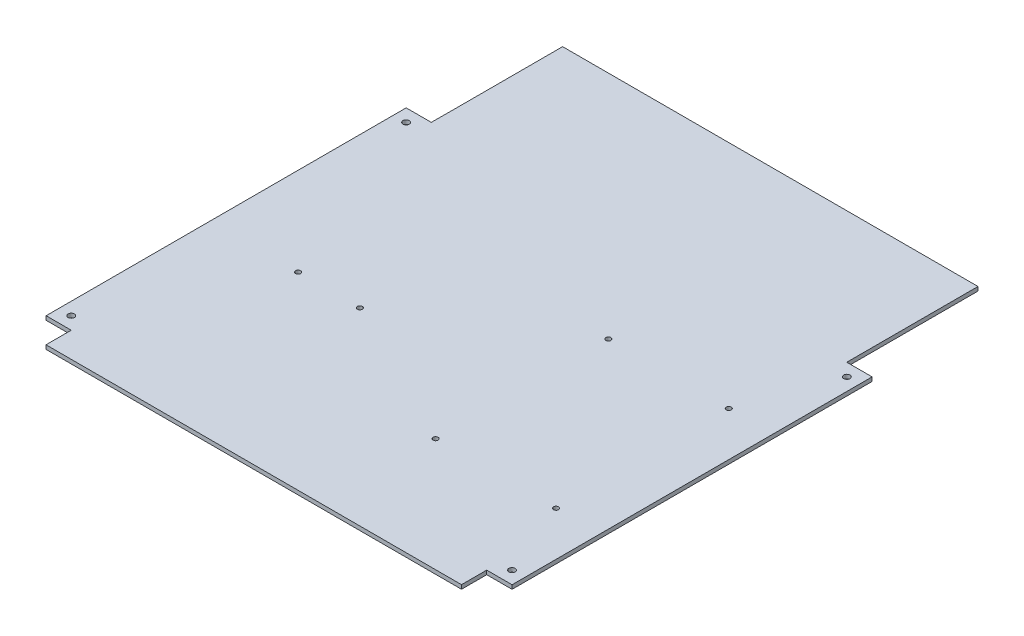
ISO-10303-21;
HEADER;
FILE_DESCRIPTION(('STEP AP214'),'2;1');
FILE_NAME('part.step','',(''),(''),'','','');
FILE_SCHEMA(('AUTOMOTIVE_DESIGN { 1 0 10303 214 1 1 1 1 }'));
ENDSEC;
DATA;
#1=APPLICATION_CONTEXT('core data for automotive mechanical design processes');
#2=APPLICATION_PROTOCOL_DEFINITION('international standard','automotive_design',2000,#1);
#3=PRODUCT_CONTEXT('',#1,'mechanical');
#4=PRODUCT('Part','Part','',(#3));
#5=PRODUCT_RELATED_PRODUCT_CATEGORY('part','',(#4));
#6=PRODUCT_DEFINITION_FORMATION('','',#4);
#7=PRODUCT_DEFINITION_CONTEXT('part definition',#1,'design');
#8=PRODUCT_DEFINITION('design','',#6,#7);
#9=PRODUCT_DEFINITION_SHAPE('','',#8);
#10=(LENGTH_UNIT() NAMED_UNIT(*) SI_UNIT(.MILLI.,.METRE.));
#11=(NAMED_UNIT(*) PLANE_ANGLE_UNIT() SI_UNIT($,.RADIAN.));
#12=(NAMED_UNIT(*) SI_UNIT($,.STERADIAN.) SOLID_ANGLE_UNIT());
#13=UNCERTAINTY_MEASURE_WITH_UNIT(LENGTH_MEASURE(1.E-05),#10,'distance_accuracy_value','');
#14=(GEOMETRIC_REPRESENTATION_CONTEXT(3) GLOBAL_UNCERTAINTY_ASSIGNED_CONTEXT((#13)) GLOBAL_UNIT_ASSIGNED_CONTEXT((#10,
#11,#12)) REPRESENTATION_CONTEXT('',''));
#15=CARTESIAN_POINT('',(0.,0.,0.));
#16=DIRECTION('',(0.,0.,1.));
#17=DIRECTION('',(1.,0.,0.));
#18=AXIS2_PLACEMENT_3D('',#15,#16,#17);
#19=CARTESIAN_POINT('',(54.0106400606065,0.,-22.3443599396149));
#20=DIRECTION('',(0.,1.,0.));
#21=DIRECTION('',(0.,0.,1.));
#22=AXIS2_PLACEMENT_3D('',#19,#20,#21);
#23=CYLINDRICAL_SURFACE('',#22,2.);
#24=CARTESIAN_POINT('',(54.0106400606065,0.,-22.3443599396149));
#25=DIRECTION('',(0.,1.,0.));
#26=DIRECTION('',(0.,0.,1.));
#27=AXIS2_PLACEMENT_3D('',#24,#25,#26);
#28=CIRCLE('',#27,2.);
#29=CARTESIAN_POINT('',(54.0106400606065,0.,-20.3443599396149));
#30=VERTEX_POINT('',#29);
#31=EDGE_CURVE('E214',#30,#30,#28,.T.);
#32=ORIENTED_EDGE('',*,*,#31,.F.);
#33=EDGE_LOOP('',(#32));
#34=FACE_BOUND('',#33,.T.);
#35=CARTESIAN_POINT('',(54.0106400606065,3.175,-22.3443599396149));
#36=DIRECTION('',(0.,1.,0.));
#37=DIRECTION('',(0.,0.,1.));
#38=AXIS2_PLACEMENT_3D('',#35,#36,#37);
#39=CIRCLE('',#38,2.);
#40=CARTESIAN_POINT('',(54.0106400606065,3.175,-20.3443599396149));
#41=VERTEX_POINT('',#40);
#42=EDGE_CURVE('E249',#41,#41,#39,.T.);
#43=ORIENTED_EDGE('',*,*,#42,.T.);
#44=EDGE_LOOP('',(#43));
#45=FACE_BOUND('',#44,.T.);
#46=ADVANCED_FACE('F45',(#34,#45),#23,.F.);
#47=CARTESIAN_POINT('',(149.510640060606,0.,114.655640060385));
#48=DIRECTION('',(0.,1.,0.));
#49=DIRECTION('',(0.,0.,1.));
#50=AXIS2_PLACEMENT_3D('',#47,#48,#49);
#51=CYLINDRICAL_SURFACE('',#50,2.);
#52=CARTESIAN_POINT('',(149.510640060606,0.,114.655640060385));
#53=DIRECTION('',(0.,1.,0.));
#54=DIRECTION('',(0.,0.,1.));
#55=AXIS2_PLACEMENT_3D('',#52,#53,#54);
#56=CIRCLE('',#55,2.);
#57=CARTESIAN_POINT('',(149.510640060606,0.,116.655640060385));
#58=VERTEX_POINT('',#57);
#59=EDGE_CURVE('E230',#58,#58,#56,.T.);
#60=ORIENTED_EDGE('',*,*,#59,.F.);
#61=EDGE_LOOP('',(#60));
#62=FACE_BOUND('',#61,.T.);
#63=CARTESIAN_POINT('',(149.510640060606,3.175,114.655640060385));
#64=DIRECTION('',(0.,1.,0.));
#65=DIRECTION('',(0.,0.,1.));
#66=AXIS2_PLACEMENT_3D('',#63,#64,#65);
#67=CIRCLE('',#66,2.);
#68=CARTESIAN_POINT('',(149.510640060606,3.175,116.655640060385));
#69=VERTEX_POINT('',#68);
#70=EDGE_CURVE('E237',#69,#69,#67,.T.);
#71=ORIENTED_EDGE('',*,*,#70,.T.);
#72=EDGE_LOOP('',(#71));
#73=FACE_BOUND('',#72,.T.);
#74=ADVANCED_FACE('F414',(#62,#73),#51,.F.);
#75=CARTESIAN_POINT('',(54.0106400606066,0.,114.655640060385));
#76=DIRECTION('',(0.,1.,0.));
#77=DIRECTION('',(0.,0.,1.));
#78=AXIS2_PLACEMENT_3D('',#75,#76,#77);
#79=CYLINDRICAL_SURFACE('',#78,2.);
#80=CARTESIAN_POINT('',(54.0106400606066,0.,114.655640060385));
#81=DIRECTION('',(0.,1.,0.));
#82=DIRECTION('',(0.,0.,1.));
#83=AXIS2_PLACEMENT_3D('',#80,#81,#82);
#84=CIRCLE('',#83,2.);
#85=CARTESIAN_POINT('',(54.0106400606066,0.,116.655640060385));
#86=VERTEX_POINT('',#85);
#87=EDGE_CURVE('E226',#86,#86,#84,.T.);
#88=ORIENTED_EDGE('',*,*,#87,.F.);
#89=EDGE_LOOP('',(#88));
#90=FACE_BOUND('',#89,.T.);
#91=CARTESIAN_POINT('',(54.0106400606066,3.175,114.655640060385));
#92=DIRECTION('',(0.,1.,0.));
#93=DIRECTION('',(0.,0.,1.));
#94=AXIS2_PLACEMENT_3D('',#91,#92,#93);
#95=CIRCLE('',#94,2.);
#96=CARTESIAN_POINT('',(54.0106400606066,3.175,116.655640060385));
#97=VERTEX_POINT('',#96);
#98=EDGE_CURVE('E232',#97,#97,#95,.T.);
#99=ORIENTED_EDGE('',*,*,#98,.T.);
#100=EDGE_LOOP('',(#99));
#101=FACE_BOUND('',#100,.T.);
#102=ADVANCED_FACE('F420',(#90,#101),#79,.F.);
#103=CARTESIAN_POINT('',(-65.9893599393937,0.,54.8056400603851));
#104=DIRECTION('',(0.,1.,0.));
#105=DIRECTION('',(0.,0.,1.));
#106=AXIS2_PLACEMENT_3D('',#103,#104,#105);
#107=CYLINDRICAL_SURFACE('',#106,2.);
#108=CARTESIAN_POINT('',(-65.9893599393937,0.,54.8056400603851));
#109=DIRECTION('',(0.,1.,0.));
#110=DIRECTION('',(0.,0.,1.));
#111=AXIS2_PLACEMENT_3D('',#108,#109,#110);
#112=CIRCLE('',#111,2.);
#113=CARTESIAN_POINT('',(-65.9893599393937,0.,56.8056400603851));
#114=VERTEX_POINT('',#113);
#115=EDGE_CURVE('E231',#114,#114,#112,.T.);
#116=ORIENTED_EDGE('',*,*,#115,.F.);
#117=EDGE_LOOP('',(#116));
#118=FACE_BOUND('',#117,.T.);
#119=CARTESIAN_POINT('',(-65.9893599393937,3.175,54.8056400603851));
#120=DIRECTION('',(0.,1.,0.));
#121=DIRECTION('',(0.,0.,1.));
#122=AXIS2_PLACEMENT_3D('',#119,#120,#121);
#123=CIRCLE('',#122,2.);
#124=CARTESIAN_POINT('',(-65.9893599393937,3.175,56.8056400603851));
#125=VERTEX_POINT('',#124);
#126=EDGE_CURVE('E236',#125,#125,#123,.T.);
#127=ORIENTED_EDGE('',*,*,#126,.T.);
#128=EDGE_LOOP('',(#127));
#129=FACE_BOUND('',#128,.T.);
#130=ADVANCED_FACE('F426',(#118,#129),#107,.F.);
#131=CARTESIAN_POINT('',(149.510640060606,0.,-22.3443599396149));
#132=DIRECTION('',(0.,1.,0.));
#133=DIRECTION('',(0.,0.,1.));
#134=AXIS2_PLACEMENT_3D('',#131,#132,#133);
#135=CYLINDRICAL_SURFACE('',#134,2.);
#136=CARTESIAN_POINT('',(149.510640060606,0.,-22.3443599396149));
#137=DIRECTION('',(0.,1.,0.));
#138=DIRECTION('',(0.,0.,1.));
#139=AXIS2_PLACEMENT_3D('',#136,#137,#138);
#140=CIRCLE('',#139,2.);
#141=CARTESIAN_POINT('',(149.510640060606,0.,-20.3443599396149));
#142=VERTEX_POINT('',#141);
#143=EDGE_CURVE('E241',#142,#142,#140,.T.);
#144=ORIENTED_EDGE('',*,*,#143,.F.);
#145=EDGE_LOOP('',(#144));
#146=FACE_BOUND('',#145,.T.);
#147=CARTESIAN_POINT('',(149.510640060606,3.175,-22.3443599396149));
#148=DIRECTION('',(0.,1.,0.));
#149=DIRECTION('',(0.,0.,1.));
#150=AXIS2_PLACEMENT_3D('',#147,#148,#149);
#151=CIRCLE('',#150,2.);
#152=CARTESIAN_POINT('',(149.510640060606,3.175,-20.3443599396149));
#153=VERTEX_POINT('',#152);
#154=EDGE_CURVE('E245',#153,#153,#151,.T.);
#155=ORIENTED_EDGE('',*,*,#154,.T.);
#156=EDGE_LOOP('',(#155));
#157=FACE_BOUND('',#156,.T.);
#158=ADVANCED_FACE('F429',(#146,#157),#135,.F.);
#159=CARTESIAN_POINT('',(-114.989359939394,0.,54.8056400603851));
#160=DIRECTION('',(0.,1.,0.));
#161=DIRECTION('',(0.,0.,1.));
#162=AXIS2_PLACEMENT_3D('',#159,#160,#161);
#163=CYLINDRICAL_SURFACE('',#162,2.);
#164=CARTESIAN_POINT('',(-114.989359939394,0.,54.8056400603851));
#165=DIRECTION('',(0.,1.,0.));
#166=DIRECTION('',(0.,0.,1.));
#167=AXIS2_PLACEMENT_3D('',#164,#165,#166);
#168=CIRCLE('',#167,2.);
#169=CARTESIAN_POINT('',(-114.989359939394,0.,56.8056400603851));
#170=VERTEX_POINT('',#169);
#171=EDGE_CURVE('E136',#170,#170,#168,.T.);
#172=ORIENTED_EDGE('',*,*,#171,.F.);
#173=EDGE_LOOP('',(#172));
#174=FACE_BOUND('',#173,.T.);
#175=CARTESIAN_POINT('',(-114.989359939394,3.175,54.8056400603851));
#176=DIRECTION('',(0.,1.,0.));
#177=DIRECTION('',(0.,0.,1.));
#178=AXIS2_PLACEMENT_3D('',#175,#176,#177);
#179=CIRCLE('',#178,2.);
#180=CARTESIAN_POINT('',(-114.989359939394,3.175,56.8056400603851));
#181=VERTEX_POINT('',#180);
#182=EDGE_CURVE('E172',#181,#181,#179,.T.);
#183=ORIENTED_EDGE('',*,*,#182,.T.);
#184=EDGE_LOOP('',(#183));
#185=FACE_BOUND('',#184,.T.);
#186=ADVANCED_FACE('F432',(#174,#185),#163,.F.);
#187=CARTESIAN_POINT('',(-165.064359939572,3.175,-100.92935993964));
#188=DIRECTION('',(0.999987611975415,0.,0.00497753912149109));
#189=DIRECTION('',(0.00497753912149109,0.,-0.999987611975416));
#190=AXIS2_PLACEMENT_3D('',#187,#188,#189);
#191=PLANE('',#190);
#192=DIRECTION('',(-0.00497753912149109,0.,0.999987611975415));
#193=VECTOR('',#192,1.);
#194=CARTESIAN_POINT('',(-165.064359939572,0.,-100.92935993964));
#195=LINE('',#194,#193);
#196=CARTESIAN_POINT('',(-164.964359939819,0.,-121.019359939579));
#197=VERTEX_POINT('',#196);
#198=CARTESIAN_POINT('',(-165.064359939572,0.,-100.92935993964));
#199=VERTEX_POINT('',#198);
#200=EDGE_CURVE('E168',#197,#199,#195,.T.);
#201=ORIENTED_EDGE('',*,*,#200,.T.);
#202=DIRECTION('',(0.,-1.,0.));
#203=VECTOR('',#202,1.);
#204=CARTESIAN_POINT('',(-165.064359939572,3.175,-100.92935993964));
#205=LINE('',#204,#203);
#206=CARTESIAN_POINT('',(-165.064359939572,3.175,-100.92935993964));
#207=VERTEX_POINT('',#206);
#208=EDGE_CURVE('E178',#207,#199,#205,.T.);
#209=ORIENTED_EDGE('',*,*,#208,.F.);
#210=DIRECTION('',(-0.00497753912149109,0.,0.999987611975415));
#211=VECTOR('',#210,1.);
#212=CARTESIAN_POINT('',(-165.064359939572,3.175,-100.92935993964));
#213=LINE('',#212,#211);
#214=CARTESIAN_POINT('',(-164.964359939819,3.175,-121.019359939579));
#215=VERTEX_POINT('',#214);
#216=EDGE_CURVE('E208',#215,#207,#213,.T.);
#217=ORIENTED_EDGE('',*,*,#216,.F.);
#218=DIRECTION('',(0.,-1.,0.));
#219=VECTOR('',#218,1.);
#220=CARTESIAN_POINT('',(-164.964359939819,3.175,-121.019359939579));
#221=LINE('',#220,#219);
#222=EDGE_CURVE('E171',#215,#197,#221,.T.);
#223=ORIENTED_EDGE('',*,*,#222,.T.);
#224=EDGE_LOOP('',(#201,#209,#217,#223));
#225=FACE_BOUND('',#224,.T.);
#226=ADVANCED_FACE('F319',(#225),#191,.F.);
#227=CARTESIAN_POINT('',(-165.064359939652,3.175,204.655640060385));
#228=DIRECTION('',(1.,0.,0.));
#229=DIRECTION('',(0.,0.,-1.));
#230=AXIS2_PLACEMENT_3D('',#227,#228,#229);
#231=PLANE('',#230);
#232=DIRECTION('',(0.,0.,1.));
#233=VECTOR('',#232,1.);
#234=CARTESIAN_POINT('',(-165.064359939652,0.,204.655640060385));
#235=LINE('',#234,#233);
#236=CARTESIAN_POINT('',(-165.064359939652,0.,184.655640060385));
#237=VERTEX_POINT('',#236);
#238=CARTESIAN_POINT('',(-165.064359939652,0.,204.655640060385));
#239=VERTEX_POINT('',#238);
#240=EDGE_CURVE('E154',#237,#239,#235,.T.);
#241=ORIENTED_EDGE('',*,*,#240,.T.);
#242=DIRECTION('',(0.,-1.,0.));
#243=VECTOR('',#242,1.);
#244=CARTESIAN_POINT('',(-165.064359939652,3.175,204.655640060385));
#245=LINE('',#244,#243);
#246=CARTESIAN_POINT('',(-165.064359939652,3.175,204.655640060385));
#247=VERTEX_POINT('',#246);
#248=EDGE_CURVE('E192',#247,#239,#245,.T.);
#249=ORIENTED_EDGE('',*,*,#248,.F.);
#250=DIRECTION('',(0.,0.,1.));
#251=VECTOR('',#250,1.);
#252=CARTESIAN_POINT('',(-165.064359939652,3.175,204.655640060385));
#253=LINE('',#252,#251);
#254=CARTESIAN_POINT('',(-165.064359939652,3.175,184.655640060385));
#255=VERTEX_POINT('',#254);
#256=EDGE_CURVE('E198',#255,#247,#253,.T.);
#257=ORIENTED_EDGE('',*,*,#256,.F.);
#258=DIRECTION('',(0.,-1.,0.));
#259=VECTOR('',#258,1.);
#260=CARTESIAN_POINT('',(-165.064359939652,3.175,184.655640060385));
#261=LINE('',#260,#259);
#262=EDGE_CURVE('E197',#255,#237,#261,.T.);
#263=ORIENTED_EDGE('',*,*,#262,.T.);
#264=EDGE_LOOP('',(#241,#249,#257,#263));
#265=FACE_BOUND('',#264,.T.);
#266=ADVANCED_FACE('F333',(#265),#231,.F.);
#267=CARTESIAN_POINT('',(164.510640060348,3.175,204.655640060385));
#268=DIRECTION('',(0.,0.,-1.));
#269=DIRECTION('',(-1.,0.,0.));
#270=AXIS2_PLACEMENT_3D('',#267,#268,#269);
#271=PLANE('',#270);
#272=DIRECTION('',(1.,0.,0.));
#273=VECTOR('',#272,1.);
#274=CARTESIAN_POINT('',(164.510640060348,0.,204.655640060385));
#275=LINE('',#274,#273);
#276=CARTESIAN_POINT('',(164.510640060348,0.,204.655640060385));
#277=VERTEX_POINT('',#276);
#278=EDGE_CURVE('E193',#239,#277,#275,.T.);
#279=ORIENTED_EDGE('',*,*,#278,.T.);
#280=DIRECTION('',(0.,-1.,0.));
#281=VECTOR('',#280,1.);
#282=CARTESIAN_POINT('',(164.510640060348,3.175,204.655640060385));
#283=LINE('',#282,#281);
#284=CARTESIAN_POINT('',(164.510640060348,3.175,204.655640060385));
#285=VERTEX_POINT('',#284);
#286=EDGE_CURVE('E183',#285,#277,#283,.T.);
#287=ORIENTED_EDGE('',*,*,#286,.F.);
#288=DIRECTION('',(1.,0.,0.));
#289=VECTOR('',#288,1.);
#290=CARTESIAN_POINT('',(164.510640060348,3.175,204.655640060385));
#291=LINE('',#290,#289);
#292=EDGE_CURVE('E201',#247,#285,#291,.T.);
#293=ORIENTED_EDGE('',*,*,#292,.F.);
#294=ORIENTED_EDGE('',*,*,#248,.T.);
#295=EDGE_LOOP('',(#279,#287,#293,#294));
#296=FACE_BOUND('',#295,.T.);
#297=ADVANCED_FACE('F339',(#296),#271,.F.);
#298=CARTESIAN_POINT('',(164.510640060348,3.175,184.655640060385));
#299=DIRECTION('',(-1.,0.,0.));
#300=DIRECTION('',(0.,0.,1.));
#301=AXIS2_PLACEMENT_3D('',#298,#299,#300);
#302=PLANE('',#301);
#303=DIRECTION('',(0.,0.,-1.));
#304=VECTOR('',#303,1.);
#305=CARTESIAN_POINT('',(164.510640060348,0.,184.655640060385));
#306=LINE('',#305,#304);
#307=CARTESIAN_POINT('',(164.510640060348,0.,184.655640060385));
#308=VERTEX_POINT('',#307);
#309=EDGE_CURVE('E189',#277,#308,#306,.T.);
#310=ORIENTED_EDGE('',*,*,#309,.T.);
#311=DIRECTION('',(0.,-1.,0.));
#312=VECTOR('',#311,1.);
#313=CARTESIAN_POINT('',(164.510640060348,3.175,184.655640060385));
#314=LINE('',#313,#312);
#315=CARTESIAN_POINT('',(164.510640060348,3.175,184.655640060385));
#316=VERTEX_POINT('',#315);
#317=EDGE_CURVE('E280',#316,#308,#314,.T.);
#318=ORIENTED_EDGE('',*,*,#317,.F.);
#319=DIRECTION('',(0.,0.,-1.));
#320=VECTOR('',#319,1.);
#321=CARTESIAN_POINT('',(164.510640060348,3.175,184.655640060385));
#322=LINE('',#321,#320);
#323=EDGE_CURVE('E220',#285,#316,#322,.T.);
#324=ORIENTED_EDGE('',*,*,#323,.F.);
#325=ORIENTED_EDGE('',*,*,#286,.T.);
#326=EDGE_LOOP('',(#310,#318,#324,#325));
#327=FACE_BOUND('',#326,.T.);
#328=ADVANCED_FACE('F345',(#327),#302,.F.);
#329=CARTESIAN_POINT('',(164.510640060428,3.175,-120.92935993964));
#330=DIRECTION('',(-1.,0.,0.));
#331=DIRECTION('',(0.,0.,1.));
#332=AXIS2_PLACEMENT_3D('',#329,#330,#331);
#333=PLANE('',#332);
#334=DIRECTION('',(0.,0.,-1.));
#335=VECTOR('',#334,1.);
#336=CARTESIAN_POINT('',(164.510640060428,0.,-120.92935993964));
#337=LINE('',#336,#335);
#338=CARTESIAN_POINT('',(164.510640060428,0.,-100.92935993964));
#339=VERTEX_POINT('',#338);
#340=CARTESIAN_POINT('',(164.510640060428,0.,-205.019359939536));
#341=VERTEX_POINT('',#340);
#342=EDGE_CURVE('E179',#339,#341,#337,.T.);
#343=ORIENTED_EDGE('',*,*,#342,.T.);
#344=DIRECTION('',(0.,1.,0.));
#345=VECTOR('',#344,1.);
#346=CARTESIAN_POINT('',(164.510640060428,-86.4588809780844,-205.019359939536));
#347=LINE('',#346,#345);
#348=CARTESIAN_POINT('',(164.510640060428,3.175,-205.019359939536));
#349=VERTEX_POINT('',#348);
#350=EDGE_CURVE('E301',#341,#349,#347,.T.);
#351=ORIENTED_EDGE('',*,*,#350,.T.);
#352=DIRECTION('',(0.,0.,-1.));
#353=VECTOR('',#352,1.);
#354=CARTESIAN_POINT('',(164.510640060428,3.175,-120.92935993964));
#355=LINE('',#354,#353);
#356=CARTESIAN_POINT('',(164.510640060428,3.175,-100.92935993964));
#357=VERTEX_POINT('',#356);
#358=EDGE_CURVE('E157',#357,#349,#355,.T.);
#359=ORIENTED_EDGE('',*,*,#358,.F.);
#360=DIRECTION('',(0.,-1.,0.));
#361=VECTOR('',#360,1.);
#362=CARTESIAN_POINT('',(164.510640060428,3.175,-100.92935993964));
#363=LINE('',#362,#361);
#364=EDGE_CURVE('E137',#357,#339,#363,.T.);
#365=ORIENTED_EDGE('',*,*,#364,.T.);
#366=EDGE_LOOP('',(#343,#351,#359,#365));
#367=FACE_BOUND('',#366,.T.);
#368=ADVANCED_FACE('F299',(#367),#333,.F.);
#369=CARTESIAN_POINT('',(0.,0.,0.));
#370=DIRECTION('',(0.,-1.,0.));
#371=DIRECTION('',(0.,0.,-1.));
#372=AXIS2_PLACEMENT_3D('',#369,#370,#371);
#373=PLANE('',#372);
#374=CARTESIAN_POINT('',(-175.019359939616,0.,-90.9343599396152));
#375=DIRECTION('',(0.,-1.,0.));
#376=DIRECTION('',(0.,0.,-1.));
#377=AXIS2_PLACEMENT_3D('',#374,#375,#376);
#378=CIRCLE('',#377,2.5);
#379=CARTESIAN_POINT('',(-175.019359939616,0.,-93.4343599396152));
#380=VERTEX_POINT('',#379);
#381=EDGE_CURVE('E393',#380,#380,#378,.F.);
#382=ORIENTED_EDGE('',*,*,#381,.T.);
#383=EDGE_LOOP('',(#382));
#384=FACE_BOUND('',#383,.T.);
#385=CARTESIAN_POINT('',(174.560640060387,0.,-90.9343599396152));
#386=DIRECTION('',(0.,-1.,0.));
#387=DIRECTION('',(0.,0.,-1.));
#388=AXIS2_PLACEMENT_3D('',#385,#386,#387);
#389=CIRCLE('',#388,2.5);
#390=CARTESIAN_POINT('',(174.560640060387,0.,-93.4343599396152));
#391=VERTEX_POINT('',#390);
#392=EDGE_CURVE('E385',#391,#391,#389,.F.);
#393=ORIENTED_EDGE('',*,*,#392,.T.);
#394=EDGE_LOOP('',(#393));
#395=FACE_BOUND('',#394,.T.);
#396=CARTESIAN_POINT('',(174.560640060388,0.,174.655640060385));
#397=DIRECTION('',(0.,-1.,0.));
#398=DIRECTION('',(0.,0.,-1.));
#399=AXIS2_PLACEMENT_3D('',#396,#397,#398);
#400=CIRCLE('',#399,2.5);
#401=CARTESIAN_POINT('',(174.560640060388,0.,172.155640060385));
#402=VERTEX_POINT('',#401);
#403=EDGE_CURVE('E377',#402,#402,#400,.F.);
#404=ORIENTED_EDGE('',*,*,#403,.T.);
#405=EDGE_LOOP('',(#404));
#406=FACE_BOUND('',#405,.T.);
#407=CARTESIAN_POINT('',(-175.019359939615,0.,174.655640060385));
#408=DIRECTION('',(0.,-1.,0.));
#409=DIRECTION('',(0.,0.,-1.));
#410=AXIS2_PLACEMENT_3D('',#407,#408,#409);
#411=CIRCLE('',#410,2.5);
#412=CARTESIAN_POINT('',(-175.019359939615,0.,172.155640060385));
#413=VERTEX_POINT('',#412);
#414=EDGE_CURVE('E307',#413,#413,#411,.F.);
#415=ORIENTED_EDGE('',*,*,#414,.T.);
#416=EDGE_LOOP('',(#415));
#417=FACE_BOUND('',#416,.T.);
#418=DIRECTION('',(0.,0.,-1.));
#419=VECTOR('',#418,1.);
#420=CARTESIAN_POINT('',(-164.964359939819,0.,-121.019359939579));
#421=LINE('',#420,#419);
#422=CARTESIAN_POINT('',(-164.964359939819,0.,-205.019359939536));
#423=VERTEX_POINT('',#422);
#424=EDGE_CURVE('E315',#197,#423,#421,.T.);
#425=ORIENTED_EDGE('',*,*,#424,.T.);
#426=DIRECTION('',(-1.,0.,0.));
#427=VECTOR('',#426,1.);
#428=CARTESIAN_POINT('',(-204.974359939579,0.,-205.019359939536));
#429=LINE('',#428,#427);
#430=EDGE_CURVE('E173',#341,#423,#429,.T.);
#431=ORIENTED_EDGE('',*,*,#430,.F.);
#432=ORIENTED_EDGE('',*,*,#342,.F.);
#433=DIRECTION('',(-1.,0.,0.));
#434=VECTOR('',#433,1.);
#435=CARTESIAN_POINT('',(164.510640060428,0.,-100.92935993964));
#436=LINE('',#435,#434);
#437=CARTESIAN_POINT('',(184.610640060427,0.,-100.92935993964));
#438=VERTEX_POINT('',#437);
#439=EDGE_CURVE('E49',#438,#339,#436,.T.);
#440=ORIENTED_EDGE('',*,*,#439,.F.);
#441=DIRECTION('',(0.,0.,-1.));
#442=VECTOR('',#441,1.);
#443=CARTESIAN_POINT('',(184.610640060427,0.,0.));
#444=LINE('',#443,#442);
#445=CARTESIAN_POINT('',(184.610640060427,0.,184.655640060385));
#446=VERTEX_POINT('',#445);
#447=EDGE_CURVE('E147',#446,#438,#444,.T.);
#448=ORIENTED_EDGE('',*,*,#447,.F.);
#449=DIRECTION('',(1.,0.,0.));
#450=VECTOR('',#449,1.);
#451=CARTESIAN_POINT('',(202.860640060427,0.,184.655640060385));
#452=LINE('',#451,#450);
#453=EDGE_CURVE('E184',#308,#446,#452,.T.);
#454=ORIENTED_EDGE('',*,*,#453,.F.);
#455=ORIENTED_EDGE('',*,*,#309,.F.);
#456=ORIENTED_EDGE('',*,*,#278,.F.);
#457=ORIENTED_EDGE('',*,*,#240,.F.);
#458=DIRECTION('',(1.,0.,0.));
#459=VECTOR('',#458,1.);
#460=CARTESIAN_POINT('',(-165.064359939652,0.,184.655640060385));
#461=LINE('',#460,#459);
#462=CARTESIAN_POINT('',(-184.974359939579,0.,184.655640060385));
#463=VERTEX_POINT('',#462);
#464=EDGE_CURVE('E143',#463,#237,#461,.T.);
#465=ORIENTED_EDGE('',*,*,#464,.F.);
#466=DIRECTION('',(0.,0.,-1.));
#467=VECTOR('',#466,1.);
#468=CARTESIAN_POINT('',(-184.974359939579,0.,184.655640060385));
#469=LINE('',#468,#467);
#470=CARTESIAN_POINT('',(-184.974359939579,0.,-100.92935993964));
#471=VERTEX_POINT('',#470);
#472=EDGE_CURVE('E127',#463,#471,#469,.T.);
#473=ORIENTED_EDGE('',*,*,#472,.T.);
#474=DIRECTION('',(-1.,0.,0.));
#475=VECTOR('',#474,1.);
#476=CARTESIAN_POINT('',(-165.064359939572,0.,-100.92935993964));
#477=LINE('',#476,#475);
#478=EDGE_CURVE('E156',#199,#471,#477,.T.);
#479=ORIENTED_EDGE('',*,*,#478,.F.);
#480=ORIENTED_EDGE('',*,*,#200,.F.);
#481=EDGE_LOOP('',(#425,#431,#432,#440,#448,#454,#455,#456,#457,#465,#473,#479,#480));
#482=FACE_BOUND('',#481,.T.);
#483=ORIENTED_EDGE('',*,*,#171,.T.);
#484=EDGE_LOOP('',(#483));
#485=FACE_BOUND('',#484,.T.);
#486=ORIENTED_EDGE('',*,*,#143,.T.);
#487=EDGE_LOOP('',(#486));
#488=FACE_BOUND('',#487,.T.);
#489=ORIENTED_EDGE('',*,*,#115,.T.);
#490=EDGE_LOOP('',(#489));
#491=FACE_BOUND('',#490,.T.);
#492=ORIENTED_EDGE('',*,*,#87,.T.);
#493=EDGE_LOOP('',(#492));
#494=FACE_BOUND('',#493,.T.);
#495=ORIENTED_EDGE('',*,*,#59,.T.);
#496=EDGE_LOOP('',(#495));
#497=FACE_BOUND('',#496,.T.);
#498=ORIENTED_EDGE('',*,*,#31,.T.);
#499=EDGE_LOOP('',(#498));
#500=FACE_BOUND('',#499,.T.);
#501=ADVANCED_FACE('F151',(#384,#395,#406,#417,#482,#485,#488,#491,#494,#497,#500),#373,.T.);
#502=CARTESIAN_POINT('',(0.,3.175,0.));
#503=DIRECTION('',(0.,-1.,0.));
#504=DIRECTION('',(0.,0.,-1.));
#505=AXIS2_PLACEMENT_3D('',#502,#503,#504);
#506=PLANE('',#505);
#507=CARTESIAN_POINT('',(-175.019359939616,3.175,-90.9343599396152));
#508=DIRECTION('',(0.,1.,0.));
#509=DIRECTION('',(0.,0.,1.));
#510=AXIS2_PLACEMENT_3D('',#507,#508,#509);
#511=CIRCLE('',#510,2.5);
#512=CARTESIAN_POINT('',(-175.019359939616,3.175,-88.4343599396152));
#513=VERTEX_POINT('',#512);
#514=EDGE_CURVE('E389',#513,#513,#511,.T.);
#515=ORIENTED_EDGE('',*,*,#514,.F.);
#516=EDGE_LOOP('',(#515));
#517=FACE_BOUND('',#516,.T.);
#518=CARTESIAN_POINT('',(174.560640060387,3.175,-90.9343599396152));
#519=DIRECTION('',(0.,1.,0.));
#520=DIRECTION('',(0.,0.,1.));
#521=AXIS2_PLACEMENT_3D('',#518,#519,#520);
#522=CIRCLE('',#521,2.5);
#523=CARTESIAN_POINT('',(174.560640060387,3.175,-88.4343599396152));
#524=VERTEX_POINT('',#523);
#525=EDGE_CURVE('E381',#524,#524,#522,.T.);
#526=ORIENTED_EDGE('',*,*,#525,.F.);
#527=EDGE_LOOP('',(#526));
#528=FACE_BOUND('',#527,.T.);
#529=CARTESIAN_POINT('',(174.560640060388,3.175,174.655640060385));
#530=DIRECTION('',(0.,1.,0.));
#531=DIRECTION('',(0.,0.,1.));
#532=AXIS2_PLACEMENT_3D('',#529,#530,#531);
#533=CIRCLE('',#532,2.5);
#534=CARTESIAN_POINT('',(174.560640060388,3.175,177.155640060385));
#535=VERTEX_POINT('',#534);
#536=EDGE_CURVE('E373',#535,#535,#533,.T.);
#537=ORIENTED_EDGE('',*,*,#536,.F.);
#538=EDGE_LOOP('',(#537));
#539=FACE_BOUND('',#538,.T.);
#540=CARTESIAN_POINT('',(-175.019359939615,3.175,174.655640060385));
#541=DIRECTION('',(0.,1.,0.));
#542=DIRECTION('',(0.,0.,1.));
#543=AXIS2_PLACEMENT_3D('',#540,#541,#542);
#544=CIRCLE('',#543,2.5);
#545=CARTESIAN_POINT('',(-175.019359939615,3.175,177.155640060385));
#546=VERTEX_POINT('',#545);
#547=EDGE_CURVE('E369',#546,#546,#544,.T.);
#548=ORIENTED_EDGE('',*,*,#547,.F.);
#549=EDGE_LOOP('',(#548));
#550=FACE_BOUND('',#549,.T.);
#551=ORIENTED_EDGE('',*,*,#182,.F.);
#552=EDGE_LOOP('',(#551));
#553=FACE_BOUND('',#552,.T.);
#554=ORIENTED_EDGE('',*,*,#154,.F.);
#555=EDGE_LOOP('',(#554));
#556=FACE_BOUND('',#555,.T.);
#557=ORIENTED_EDGE('',*,*,#126,.F.);
#558=EDGE_LOOP('',(#557));
#559=FACE_BOUND('',#558,.T.);
#560=ORIENTED_EDGE('',*,*,#98,.F.);
#561=EDGE_LOOP('',(#560));
#562=FACE_BOUND('',#561,.T.);
#563=ORIENTED_EDGE('',*,*,#70,.F.);
#564=EDGE_LOOP('',(#563));
#565=FACE_BOUND('',#564,.T.);
#566=ORIENTED_EDGE('',*,*,#42,.F.);
#567=EDGE_LOOP('',(#566));
#568=FACE_BOUND('',#567,.T.);
#569=DIRECTION('',(-1.,0.,0.));
#570=VECTOR('',#569,1.);
#571=CARTESIAN_POINT('',(-204.974359939579,3.175,-205.019359939536));
#572=LINE('',#571,#570);
#573=CARTESIAN_POINT('',(-164.964359939819,3.175,-205.019359939536));
#574=VERTEX_POINT('',#573);
#575=EDGE_CURVE('E211',#349,#574,#572,.T.);
#576=ORIENTED_EDGE('',*,*,#575,.T.);
#577=DIRECTION('',(0.,0.,-1.));
#578=VECTOR('',#577,1.);
#579=CARTESIAN_POINT('',(-164.964359939819,3.175,-121.019359939579));
#580=LINE('',#579,#578);
#581=EDGE_CURVE('E63',#215,#574,#580,.T.);
#582=ORIENTED_EDGE('',*,*,#581,.F.);
#583=ORIENTED_EDGE('',*,*,#216,.T.);
#584=DIRECTION('',(-1.,0.,0.));
#585=VECTOR('',#584,1.);
#586=CARTESIAN_POINT('',(-165.064359939572,3.175,-100.92935993964));
#587=LINE('',#586,#585);
#588=CARTESIAN_POINT('',(-184.974359939579,3.175,-100.92935993964));
#589=VERTEX_POINT('',#588);
#590=EDGE_CURVE('E204',#207,#589,#587,.T.);
#591=ORIENTED_EDGE('',*,*,#590,.T.);
#592=DIRECTION('',(0.,0.,-1.));
#593=VECTOR('',#592,1.);
#594=CARTESIAN_POINT('',(-184.974359939579,3.175,184.655640060385));
#595=LINE('',#594,#593);
#596=CARTESIAN_POINT('',(-184.974359939579,3.175,184.655640060385));
#597=VERTEX_POINT('',#596);
#598=EDGE_CURVE('E11',#597,#589,#595,.T.);
#599=ORIENTED_EDGE('',*,*,#598,.F.);
#600=DIRECTION('',(1.,0.,0.));
#601=VECTOR('',#600,1.);
#602=CARTESIAN_POINT('',(-165.064359939652,3.175,184.655640060385));
#603=LINE('',#602,#601);
#604=EDGE_CURVE('E145',#597,#255,#603,.T.);
#605=ORIENTED_EDGE('',*,*,#604,.T.);
#606=ORIENTED_EDGE('',*,*,#256,.T.);
#607=ORIENTED_EDGE('',*,*,#292,.T.);
#608=ORIENTED_EDGE('',*,*,#323,.T.);
#609=DIRECTION('',(1.,0.,0.));
#610=VECTOR('',#609,1.);
#611=CARTESIAN_POINT('',(202.860640060427,3.175,184.655640060385));
#612=LINE('',#611,#610);
#613=CARTESIAN_POINT('',(184.610640060427,3.175,184.655640060385));
#614=VERTEX_POINT('',#613);
#615=EDGE_CURVE('E216',#316,#614,#612,.T.);
#616=ORIENTED_EDGE('',*,*,#615,.T.);
#617=DIRECTION('',(0.,0.,1.));
#618=VECTOR('',#617,1.);
#619=CARTESIAN_POINT('',(184.610640060427,3.175,-205.019359939536));
#620=LINE('',#619,#618);
#621=CARTESIAN_POINT('',(184.610640060427,3.175,-100.92935993964));
#622=VERTEX_POINT('',#621);
#623=EDGE_CURVE('E277',#622,#614,#620,.T.);
#624=ORIENTED_EDGE('',*,*,#623,.F.);
#625=DIRECTION('',(-1.,0.,0.));
#626=VECTOR('',#625,1.);
#627=CARTESIAN_POINT('',(164.510640060428,3.175,-100.92935993964));
#628=LINE('',#627,#626);
#629=EDGE_CURVE('E163',#622,#357,#628,.T.);
#630=ORIENTED_EDGE('',*,*,#629,.T.);
#631=ORIENTED_EDGE('',*,*,#358,.T.);
#632=EDGE_LOOP('',(#576,#582,#583,#591,#599,#605,#606,#607,#608,#616,#624,#630,#631));
#633=FACE_BOUND('',#632,.T.);
#634=ADVANCED_FACE('F288',(#517,#528,#539,#550,#553,#556,#559,#562,#565,#568,#633),#506,.F.);
#635=CARTESIAN_POINT('',(-165.064359939652,3.175,184.655640060385));
#636=DIRECTION('',(0.,0.,-1.));
#637=DIRECTION('',(-1.,0.,0.));
#638=AXIS2_PLACEMENT_3D('',#635,#636,#637);
#639=PLANE('',#638);
#640=ORIENTED_EDGE('',*,*,#604,.F.);
#641=DIRECTION('',(0.,1.,0.));
#642=VECTOR('',#641,1.);
#643=CARTESIAN_POINT('',(-184.974359939579,0.,184.655640060385));
#644=LINE('',#643,#642);
#645=EDGE_CURVE('E55',#463,#597,#644,.T.);
#646=ORIENTED_EDGE('',*,*,#645,.F.);
#647=ORIENTED_EDGE('',*,*,#464,.T.);
#648=ORIENTED_EDGE('',*,*,#262,.F.);
#649=EDGE_LOOP('',(#640,#646,#647,#648));
#650=FACE_BOUND('',#649,.T.);
#651=ADVANCED_FACE('F141',(#650),#639,.F.);
#652=CARTESIAN_POINT('',(-165.064359939572,3.175,-100.92935993964));
#653=DIRECTION('',(0.,0.,1.));
#654=DIRECTION('',(1.,0.,0.));
#655=AXIS2_PLACEMENT_3D('',#652,#653,#654);
#656=PLANE('',#655);
#657=ORIENTED_EDGE('',*,*,#478,.T.);
#658=DIRECTION('',(0.,1.,0.));
#659=VECTOR('',#658,1.);
#660=CARTESIAN_POINT('',(-184.974359939579,3.175,-100.92935993964));
#661=LINE('',#660,#659);
#662=EDGE_CURVE('E71',#471,#589,#661,.T.);
#663=ORIENTED_EDGE('',*,*,#662,.T.);
#664=ORIENTED_EDGE('',*,*,#590,.F.);
#665=ORIENTED_EDGE('',*,*,#208,.T.);
#666=EDGE_LOOP('',(#657,#663,#664,#665));
#667=FACE_BOUND('',#666,.T.);
#668=ADVANCED_FACE('F327',(#667),#656,.F.);
#669=CARTESIAN_POINT('',(-204.974359939579,3.175,-205.019359939536));
#670=DIRECTION('',(0.,0.,1.));
#671=DIRECTION('',(1.,0.,0.));
#672=AXIS2_PLACEMENT_3D('',#669,#670,#671);
#673=PLANE('',#672);
#674=ORIENTED_EDGE('',*,*,#430,.T.);
#675=DIRECTION('',(0.,1.,0.));
#676=VECTOR('',#675,1.);
#677=CARTESIAN_POINT('',(-164.964359939819,-86.4588809780844,-205.019359939536));
#678=LINE('',#677,#676);
#679=EDGE_CURVE('E253',#423,#574,#678,.T.);
#680=ORIENTED_EDGE('',*,*,#679,.T.);
#681=ORIENTED_EDGE('',*,*,#575,.F.);
#682=ORIENTED_EDGE('',*,*,#350,.F.);
#683=EDGE_LOOP('',(#674,#680,#681,#682));
#684=FACE_BOUND('',#683,.T.);
#685=ADVANCED_FACE('F309',(#684),#673,.F.);
#686=CARTESIAN_POINT('',(164.510640060428,3.175,-100.92935993964));
#687=DIRECTION('',(0.,0.,1.));
#688=DIRECTION('',(1.,0.,0.));
#689=AXIS2_PLACEMENT_3D('',#686,#687,#688);
#690=PLANE('',#689);
#691=ORIENTED_EDGE('',*,*,#629,.F.);
#692=DIRECTION('',(0.,-1.,0.));
#693=VECTOR('',#692,1.);
#694=CARTESIAN_POINT('',(184.610640060427,3.175,-100.92935993964));
#695=LINE('',#694,#693);
#696=EDGE_CURVE('E177',#622,#438,#695,.T.);
#697=ORIENTED_EDGE('',*,*,#696,.T.);
#698=ORIENTED_EDGE('',*,*,#439,.T.);
#699=ORIENTED_EDGE('',*,*,#364,.F.);
#700=EDGE_LOOP('',(#691,#697,#698,#699));
#701=FACE_BOUND('',#700,.T.);
#702=ADVANCED_FACE('F47',(#701),#690,.F.);
#703=CARTESIAN_POINT('',(202.860640060427,3.175,184.655640060385));
#704=DIRECTION('',(0.,0.,-1.));
#705=DIRECTION('',(-1.,0.,0.));
#706=AXIS2_PLACEMENT_3D('',#703,#704,#705);
#707=PLANE('',#706);
#708=ORIENTED_EDGE('',*,*,#453,.T.);
#709=DIRECTION('',(0.,1.,0.));
#710=VECTOR('',#709,1.);
#711=CARTESIAN_POINT('',(184.610640060427,0.,184.655640060385));
#712=LINE('',#711,#710);
#713=EDGE_CURVE('E188',#446,#614,#712,.T.);
#714=ORIENTED_EDGE('',*,*,#713,.T.);
#715=ORIENTED_EDGE('',*,*,#615,.F.);
#716=ORIENTED_EDGE('',*,*,#317,.T.);
#717=EDGE_LOOP('',(#708,#714,#715,#716));
#718=FACE_BOUND('',#717,.T.);
#719=ADVANCED_FACE('F350',(#718),#707,.F.);
#720=CARTESIAN_POINT('',(184.610640060427,0.,-205.019359939536));
#721=DIRECTION('',(-1.,0.,0.));
#722=DIRECTION('',(0.,0.,1.));
#723=AXIS2_PLACEMENT_3D('',#720,#721,#722);
#724=PLANE('',#723);
#725=ORIENTED_EDGE('',*,*,#623,.T.);
#726=ORIENTED_EDGE('',*,*,#713,.F.);
#727=ORIENTED_EDGE('',*,*,#447,.T.);
#728=ORIENTED_EDGE('',*,*,#696,.F.);
#729=EDGE_LOOP('',(#725,#726,#727,#728));
#730=FACE_BOUND('',#729,.T.);
#731=ADVANCED_FACE('F354',(#730),#724,.F.);
#732=CARTESIAN_POINT('',(-184.974359939579,0.,184.655640060385));
#733=DIRECTION('',(1.,0.,0.));
#734=DIRECTION('',(0.,0.,-1.));
#735=AXIS2_PLACEMENT_3D('',#732,#733,#734);
#736=PLANE('',#735);
#737=ORIENTED_EDGE('',*,*,#472,.F.);
#738=ORIENTED_EDGE('',*,*,#645,.T.);
#739=ORIENTED_EDGE('',*,*,#598,.T.);
#740=ORIENTED_EDGE('',*,*,#662,.F.);
#741=EDGE_LOOP('',(#737,#738,#739,#740));
#742=FACE_BOUND('',#741,.T.);
#743=ADVANCED_FACE('F129',(#742),#736,.F.);
#744=CARTESIAN_POINT('',(-164.964359939819,-86.4588809780844,-121.019359939579));
#745=DIRECTION('',(1.,0.,0.));
#746=DIRECTION('',(0.,0.,-1.));
#747=AXIS2_PLACEMENT_3D('',#744,#745,#746);
#748=PLANE('',#747);
#749=ORIENTED_EDGE('',*,*,#222,.F.);
#750=ORIENTED_EDGE('',*,*,#581,.T.);
#751=ORIENTED_EDGE('',*,*,#679,.F.);
#752=ORIENTED_EDGE('',*,*,#424,.F.);
#753=EDGE_LOOP('',(#749,#750,#751,#752));
#754=FACE_BOUND('',#753,.T.);
#755=ADVANCED_FACE('F441',(#754),#748,.F.);
#756=CARTESIAN_POINT('',(-175.019359939615,-7.07106781186548,174.655640060385));
#757=DIRECTION('',(0.,1.,0.));
#758=DIRECTION('',(0.,0.,1.));
#759=AXIS2_PLACEMENT_3D('',#756,#757,#758);
#760=CYLINDRICAL_SURFACE('',#759,2.5);
#761=ORIENTED_EDGE('',*,*,#547,.T.);
#762=EDGE_LOOP('',(#761));
#763=FACE_BOUND('',#762,.T.);
#764=ORIENTED_EDGE('',*,*,#414,.F.);
#765=EDGE_LOOP('',(#764));
#766=FACE_BOUND('',#765,.T.);
#767=ADVANCED_FACE('F592',(#763,#766),#760,.F.);
#768=CARTESIAN_POINT('',(174.560640060388,-7.07106781186548,174.655640060385));
#769=DIRECTION('',(0.,1.,0.));
#770=DIRECTION('',(0.,0.,1.));
#771=AXIS2_PLACEMENT_3D('',#768,#769,#770);
#772=CYLINDRICAL_SURFACE('',#771,2.5);
#773=ORIENTED_EDGE('',*,*,#536,.T.);
#774=EDGE_LOOP('',(#773));
#775=FACE_BOUND('',#774,.T.);
#776=ORIENTED_EDGE('',*,*,#403,.F.);
#777=EDGE_LOOP('',(#776));
#778=FACE_BOUND('',#777,.T.);
#779=ADVANCED_FACE('F409',(#775,#778),#772,.F.);
#780=CARTESIAN_POINT('',(174.560640060387,-7.07106781186548,-90.9343599396152));
#781=DIRECTION('',(0.,1.,0.));
#782=DIRECTION('',(0.,0.,1.));
#783=AXIS2_PLACEMENT_3D('',#780,#781,#782);
#784=CYLINDRICAL_SURFACE('',#783,2.5);
#785=ORIENTED_EDGE('',*,*,#525,.T.);
#786=EDGE_LOOP('',(#785));
#787=FACE_BOUND('',#786,.T.);
#788=ORIENTED_EDGE('',*,*,#392,.F.);
#789=EDGE_LOOP('',(#788));
#790=FACE_BOUND('',#789,.T.);
#791=ADVANCED_FACE('F403',(#787,#790),#784,.F.);
#792=CARTESIAN_POINT('',(-175.019359939616,-7.07106781186548,-90.9343599396152));
#793=DIRECTION('',(0.,1.,0.));
#794=DIRECTION('',(0.,0.,1.));
#795=AXIS2_PLACEMENT_3D('',#792,#793,#794);
#796=CYLINDRICAL_SURFACE('',#795,2.5);
#797=ORIENTED_EDGE('',*,*,#514,.T.);
#798=EDGE_LOOP('',(#797));
#799=FACE_BOUND('',#798,.T.);
#800=ORIENTED_EDGE('',*,*,#381,.F.);
#801=EDGE_LOOP('',(#800));
#802=FACE_BOUND('',#801,.T.);
#803=ADVANCED_FACE('F401',(#799,#802),#796,.F.);
#804=CLOSED_SHELL('',(#46,#74,#102,#130,#158,#186,#226,#266,#297,#328,#368,#501,#634,#651,#668,
#685,#702,#719,#731,#743,#755,#767,#779,#791,#803));
#805=MANIFOLD_SOLID_BREP('B2',#804);
#806=ADVANCED_BREP_SHAPE_REPRESENTATION('',(#18,#805),#14);
#807=SHAPE_DEFINITION_REPRESENTATION(#9,#806);
ENDSEC;
END-ISO-10303-21;
